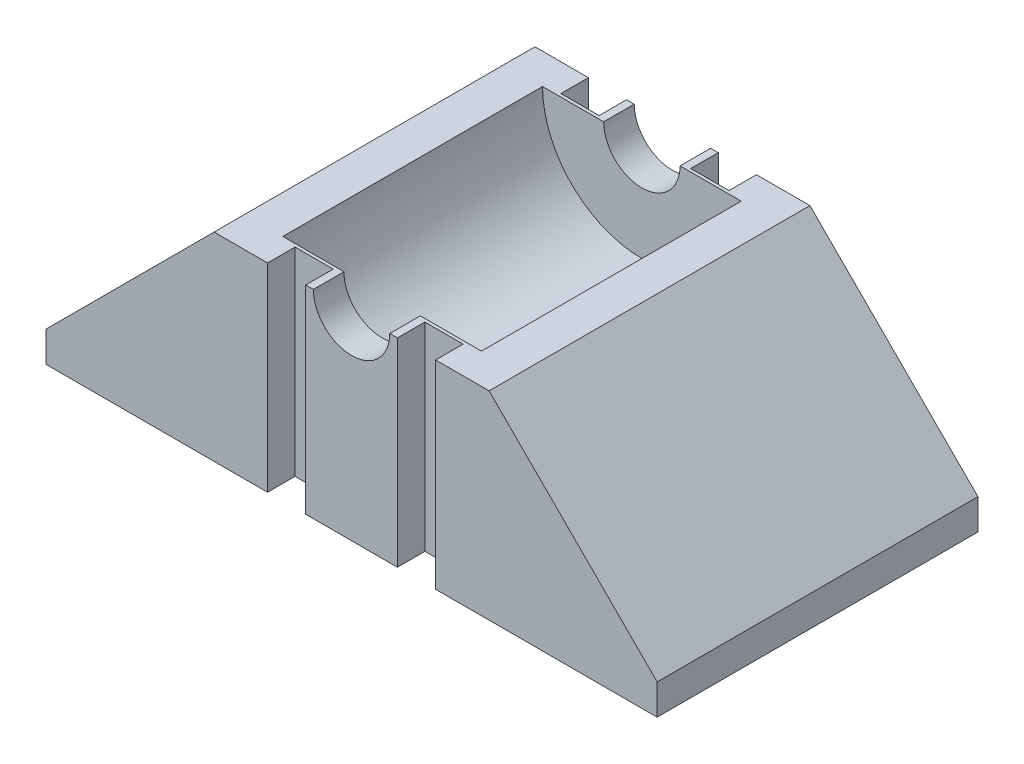
ISO-10303-21;
HEADER;
FILE_DESCRIPTION(('STEP AP214'),'2;1');
FILE_NAME('part.step','',(''),(''),'','','');
FILE_SCHEMA(('AUTOMOTIVE_DESIGN { 1 0 10303 214 1 1 1 1 }'));
ENDSEC;
DATA;
#1=APPLICATION_CONTEXT('core data for automotive mechanical design processes');
#2=APPLICATION_PROTOCOL_DEFINITION('international standard','automotive_design',2000,#1);
#3=PRODUCT_CONTEXT('',#1,'mechanical');
#4=PRODUCT('Part','Part','',(#3));
#5=PRODUCT_RELATED_PRODUCT_CATEGORY('part','',(#4));
#6=PRODUCT_DEFINITION_FORMATION('','',#4);
#7=PRODUCT_DEFINITION_CONTEXT('part definition',#1,'design');
#8=PRODUCT_DEFINITION('design','',#6,#7);
#9=PRODUCT_DEFINITION_SHAPE('','',#8);
#10=(LENGTH_UNIT() NAMED_UNIT(*) SI_UNIT(.MILLI.,.METRE.));
#11=(NAMED_UNIT(*) PLANE_ANGLE_UNIT() SI_UNIT($,.RADIAN.));
#12=(NAMED_UNIT(*) SI_UNIT($,.STERADIAN.) SOLID_ANGLE_UNIT());
#13=UNCERTAINTY_MEASURE_WITH_UNIT(LENGTH_MEASURE(1.E-05),#10,'distance_accuracy_value','');
#14=(GEOMETRIC_REPRESENTATION_CONTEXT(3) GLOBAL_UNCERTAINTY_ASSIGNED_CONTEXT((#13)) GLOBAL_UNIT_ASSIGNED_CONTEXT((#10,
#11,#12)) REPRESENTATION_CONTEXT('',''));
#15=CARTESIAN_POINT('',(0.,0.,0.));
#16=DIRECTION('',(0.,0.,1.));
#17=DIRECTION('',(1.,0.,0.));
#18=AXIS2_PLACEMENT_3D('',#15,#16,#17);
#19=CARTESIAN_POINT('',(0.,0.,10.5));
#20=DIRECTION('',(0.,0.,1.));
#21=DIRECTION('',(1.,0.,0.));
#22=AXIS2_PLACEMENT_3D('',#19,#20,#21);
#23=PLANE('',#22);
#24=DIRECTION('',(0.,-1.,0.));
#25=VECTOR('',#24,1.);
#26=CARTESIAN_POINT('',(-25.5,0.,10.5));
#27=LINE('',#26,#25);
#28=CARTESIAN_POINT('',(-25.5,13.,10.5));
#29=VERTEX_POINT('',#28);
#30=CARTESIAN_POINT('',(-25.5,0.,10.5));
#31=VERTEX_POINT('',#30);
#32=EDGE_CURVE('E11',#29,#31,#27,.T.);
#33=ORIENTED_EDGE('',*,*,#32,.F.);
#34=DIRECTION('',(-1.,0.,0.));
#35=VECTOR('',#34,1.);
#36=CARTESIAN_POINT('',(-40.,13.,10.5));
#37=LINE('',#36,#35);
#38=CARTESIAN_POINT('',(-29.,13.,10.5));
#39=VERTEX_POINT('',#38);
#40=EDGE_CURVE('E459',#29,#39,#37,.T.);
#41=ORIENTED_EDGE('',*,*,#40,.T.);
#42=DIRECTION('',(0.707106781186549,0.707106781186546,0.));
#43=VECTOR('',#42,1.);
#44=CARTESIAN_POINT('',(-20.9999999999999,21.,10.5));
#45=LINE('',#44,#43);
#46=CARTESIAN_POINT('',(-40.,2.00000000000003,10.5));
#47=VERTEX_POINT('',#46);
#48=EDGE_CURVE('E508',#39,#47,#45,.F.);
#49=ORIENTED_EDGE('',*,*,#48,.T.);
#50=DIRECTION('',(0.,-1.,0.));
#51=VECTOR('',#50,1.);
#52=CARTESIAN_POINT('',(-40.,13.,10.5));
#53=LINE('',#52,#51);
#54=CARTESIAN_POINT('',(-40.,0.,10.5));
#55=VERTEX_POINT('',#54);
#56=EDGE_CURVE('E446',#47,#55,#53,.T.);
#57=ORIENTED_EDGE('',*,*,#56,.T.);
#58=DIRECTION('',(1.,0.,0.));
#59=VECTOR('',#58,1.);
#60=CARTESIAN_POINT('',(-40.,0.,10.5));
#61=LINE('',#60,#59);
#62=EDGE_CURVE('E450',#55,#31,#61,.T.);
#63=ORIENTED_EDGE('',*,*,#62,.T.);
#64=EDGE_LOOP('',(#33,#41,#49,#57,#63));
#65=FACE_BOUND('',#64,.T.);
#66=ADVANCED_FACE('F44',(#65),#23,.T.);
#67=DIRECTION('',(0.,1.,0.));
#68=VECTOR('',#67,1.);
#69=CARTESIAN_POINT('',(-14.5,0.,10.5));
#70=LINE('',#69,#68);
#71=CARTESIAN_POINT('',(-14.5,0.,10.5));
#72=VERTEX_POINT('',#71);
#73=CARTESIAN_POINT('',(-14.5,13.,10.5));
#74=VERTEX_POINT('',#73);
#75=EDGE_CURVE('E533',#72,#74,#70,.T.);
#76=ORIENTED_EDGE('',*,*,#75,.F.);
#77=CARTESIAN_POINT('',(0.,0.,10.5));
#78=VERTEX_POINT('',#77);
#79=EDGE_CURVE('E449',#72,#78,#61,.T.);
#80=ORIENTED_EDGE('',*,*,#79,.T.);
#81=DIRECTION('',(0.,1.,0.));
#82=VECTOR('',#81,1.);
#83=CARTESIAN_POINT('',(0.,13.,10.5));
#84=LINE('',#83,#82);
#85=CARTESIAN_POINT('',(0.,1.99999999999998,10.5));
#86=VERTEX_POINT('',#85);
#87=EDGE_CURVE('E454',#78,#86,#84,.T.);
#88=ORIENTED_EDGE('',*,*,#87,.T.);
#89=DIRECTION('',(0.707106781186547,-0.707106781186548,0.));
#90=VECTOR('',#89,1.);
#91=CARTESIAN_POINT('',(0.99999999999999,0.999999999999987,10.5));
#92=LINE('',#91,#90);
#93=CARTESIAN_POINT('',(-11.,13.,10.5));
#94=VERTEX_POINT('',#93);
#95=EDGE_CURVE('E505',#86,#94,#92,.F.);
#96=ORIENTED_EDGE('',*,*,#95,.T.);
#97=EDGE_CURVE('E460',#94,#74,#37,.T.);
#98=ORIENTED_EDGE('',*,*,#97,.T.);
#99=EDGE_LOOP('',(#76,#80,#88,#96,#98));
#100=FACE_BOUND('',#99,.T.);
#101=ADVANCED_FACE('F604',(#100),#23,.T.);
#102=CARTESIAN_POINT('',(0.,0.,-10.5));
#103=DIRECTION('',(0.,0.,-1.));
#104=DIRECTION('',(1.,0.,0.));
#105=AXIS2_PLACEMENT_3D('',#102,#103,#104);
#106=PLANE('',#105);
#107=DIRECTION('',(0.,1.,0.));
#108=VECTOR('',#107,1.);
#109=CARTESIAN_POINT('',(-17.,0.,-10.5));
#110=LINE('',#109,#108);
#111=CARTESIAN_POINT('',(-17.,0.,-10.5));
#112=VERTEX_POINT('',#111);
#113=CARTESIAN_POINT('',(-17.,13.,-10.5));
#114=VERTEX_POINT('',#113);
#115=EDGE_CURVE('E527',#112,#114,#110,.T.);
#116=ORIENTED_EDGE('',*,*,#115,.F.);
#117=DIRECTION('',(1.,0.,0.));
#118=VECTOR('',#117,1.);
#119=CARTESIAN_POINT('',(-40.,0.,-10.5));
#120=LINE('',#119,#118);
#121=CARTESIAN_POINT('',(-23.,0.,-10.5));
#122=VERTEX_POINT('',#121);
#123=EDGE_CURVE('E422',#122,#112,#120,.T.);
#124=ORIENTED_EDGE('',*,*,#123,.F.);
#125=DIRECTION('',(0.,-1.,0.));
#126=VECTOR('',#125,1.);
#127=CARTESIAN_POINT('',(-23.,0.,-10.5));
#128=LINE('',#127,#126);
#129=CARTESIAN_POINT('',(-23.,13.,-10.5));
#130=VERTEX_POINT('',#129);
#131=EDGE_CURVE('E518',#130,#122,#128,.T.);
#132=ORIENTED_EDGE('',*,*,#131,.F.);
#133=DIRECTION('',(-1.,0.,0.));
#134=VECTOR('',#133,1.);
#135=CARTESIAN_POINT('',(-40.,13.,-10.5));
#136=LINE('',#135,#134);
#137=CARTESIAN_POINT('',(-22.5,13.,-10.5));
#138=VERTEX_POINT('',#137);
#139=EDGE_CURVE('E414',#138,#130,#136,.T.);
#140=ORIENTED_EDGE('',*,*,#139,.F.);
#141=CARTESIAN_POINT('',(-20.,13.,-10.5));
#142=DIRECTION('',(0.,0.,1.));
#143=DIRECTION('',(1.,0.,0.));
#144=AXIS2_PLACEMENT_3D('',#141,#142,#143);
#145=CIRCLE('',#144,2.5);
#146=CARTESIAN_POINT('',(-17.5,13.,-10.5));
#147=VERTEX_POINT('',#146);
#148=EDGE_CURVE('E386',#138,#147,#145,.T.);
#149=ORIENTED_EDGE('',*,*,#148,.T.);
#150=EDGE_CURVE('E413',#114,#147,#136,.T.);
#151=ORIENTED_EDGE('',*,*,#150,.F.);
#152=EDGE_LOOP('',(#116,#124,#132,#140,#149,#151));
#153=FACE_BOUND('',#152,.T.);
#154=ADVANCED_FACE('F577',(#153),#106,.T.);
#155=DIRECTION('',(0.,1.,0.));
#156=VECTOR('',#155,1.);
#157=CARTESIAN_POINT('',(-25.5,0.,-10.5));
#158=LINE('',#157,#156);
#159=CARTESIAN_POINT('',(-25.5,0.,-10.5));
#160=VERTEX_POINT('',#159);
#161=CARTESIAN_POINT('',(-25.5,13.,-10.5));
#162=VERTEX_POINT('',#161);
#163=EDGE_CURVE('E521',#160,#162,#158,.T.);
#164=ORIENTED_EDGE('',*,*,#163,.F.);
#165=CARTESIAN_POINT('',(-40.,0.,-10.5));
#166=VERTEX_POINT('',#165);
#167=EDGE_CURVE('E258',#166,#160,#120,.T.);
#168=ORIENTED_EDGE('',*,*,#167,.F.);
#169=DIRECTION('',(0.,-1.,0.));
#170=VECTOR('',#169,1.);
#171=CARTESIAN_POINT('',(-40.,13.,-10.5));
#172=LINE('',#171,#170);
#173=CARTESIAN_POINT('',(-40.,2.00000000000003,-10.5));
#174=VERTEX_POINT('',#173);
#175=EDGE_CURVE('E404',#174,#166,#172,.T.);
#176=ORIENTED_EDGE('',*,*,#175,.F.);
#177=DIRECTION('',(-0.707106781186549,-0.707106781186546,0.));
#178=VECTOR('',#177,1.);
#179=CARTESIAN_POINT('',(-20.9999999999999,21.,-10.5));
#180=LINE('',#179,#178);
#181=CARTESIAN_POINT('',(-29.,13.,-10.5));
#182=VERTEX_POINT('',#181);
#183=EDGE_CURVE('E497',#174,#182,#180,.F.);
#184=ORIENTED_EDGE('',*,*,#183,.T.);
#185=EDGE_CURVE('E407',#162,#182,#136,.T.);
#186=ORIENTED_EDGE('',*,*,#185,.F.);
#187=EDGE_LOOP('',(#164,#168,#176,#184,#186));
#188=FACE_BOUND('',#187,.T.);
#189=ADVANCED_FACE('F565',(#188),#106,.T.);
#190=CARTESIAN_POINT('',(-40.,13.,10.5));
#191=DIRECTION('',(0.,-1.,0.));
#192=DIRECTION('',(0.,0.,-1.));
#193=AXIS2_PLACEMENT_3D('',#190,#191,#192);
#194=PLANE('',#193);
#195=ORIENTED_EDGE('',*,*,#40,.F.);
#196=DIRECTION('',(0.,0.,-1.));
#197=VECTOR('',#196,1.);
#198=CARTESIAN_POINT('',(-25.5,13.,10.5));
#199=LINE('',#198,#197);
#200=CARTESIAN_POINT('',(-25.5,13.,8.7));
#201=VERTEX_POINT('',#200);
#202=EDGE_CURVE('E338',#29,#201,#199,.T.);
#203=ORIENTED_EDGE('',*,*,#202,.T.);
#204=DIRECTION('',(1.,0.,0.));
#205=VECTOR('',#204,1.);
#206=CARTESIAN_POINT('',(-40.,13.,8.69999999999999));
#207=LINE('',#206,#205);
#208=CARTESIAN_POINT('',(-23.,13.,8.7));
#209=VERTEX_POINT('',#208);
#210=EDGE_CURVE('E353',#201,#209,#207,.T.);
#211=ORIENTED_EDGE('',*,*,#210,.T.);
#212=DIRECTION('',(0.,0.,1.));
#213=VECTOR('',#212,1.);
#214=CARTESIAN_POINT('',(-23.,13.,10.5));
#215=LINE('',#214,#213);
#216=CARTESIAN_POINT('',(-23.,13.,10.5));
#217=VERTEX_POINT('',#216);
#218=EDGE_CURVE('E334',#209,#217,#215,.T.);
#219=ORIENTED_EDGE('',*,*,#218,.T.);
#220=CARTESIAN_POINT('',(-22.5,13.,10.5));
#221=VERTEX_POINT('',#220);
#222=EDGE_CURVE('E466',#221,#217,#37,.T.);
#223=ORIENTED_EDGE('',*,*,#222,.F.);
#224=DIRECTION('',(0.,0.,1.));
#225=VECTOR('',#224,1.);
#226=CARTESIAN_POINT('',(-22.5,13.,6.));
#227=LINE('',#226,#225);
#228=CARTESIAN_POINT('',(-22.5,13.,8.5));
#229=VERTEX_POINT('',#228);
#230=EDGE_CURVE('E426',#221,#229,#227,.F.);
#231=ORIENTED_EDGE('',*,*,#230,.T.);
#232=DIRECTION('',(1.,0.,0.));
#233=VECTOR('',#232,1.);
#234=CARTESIAN_POINT('',(-40.,13.,8.5));
#235=LINE('',#234,#233);
#236=CARTESIAN_POINT('',(-26.5,13.,8.5));
#237=VERTEX_POINT('',#236);
#238=EDGE_CURVE('E474',#237,#229,#235,.T.);
#239=ORIENTED_EDGE('',*,*,#238,.F.);
#240=DIRECTION('',(0.,0.,-1.));
#241=VECTOR('',#240,1.);
#242=CARTESIAN_POINT('',(-26.5,13.,8.5));
#243=LINE('',#242,#241);
#244=CARTESIAN_POINT('',(-26.5,13.,-8.5));
#245=VERTEX_POINT('',#244);
#246=EDGE_CURVE('E442',#237,#245,#243,.T.);
#247=ORIENTED_EDGE('',*,*,#246,.T.);
#248=DIRECTION('',(-1.,0.,0.));
#249=VECTOR('',#248,1.);
#250=CARTESIAN_POINT('',(-40.,13.,-8.5));
#251=LINE('',#250,#249);
#252=CARTESIAN_POINT('',(-22.5,13.,-8.5));
#253=VERTEX_POINT('',#252);
#254=EDGE_CURVE('E481',#253,#245,#251,.T.);
#255=ORIENTED_EDGE('',*,*,#254,.F.);
#256=DIRECTION('',(0.,0.,-1.));
#257=VECTOR('',#256,1.);
#258=CARTESIAN_POINT('',(-22.5,13.,-6.));
#259=LINE('',#258,#257);
#260=EDGE_CURVE('E397',#138,#253,#259,.F.);
#261=ORIENTED_EDGE('',*,*,#260,.F.);
#262=ORIENTED_EDGE('',*,*,#139,.T.);
#263=DIRECTION('',(0.,0.,1.));
#264=VECTOR('',#263,1.);
#265=CARTESIAN_POINT('',(-23.,13.,10.5));
#266=LINE('',#265,#264);
#267=CARTESIAN_POINT('',(-23.,13.,-8.7));
#268=VERTEX_POINT('',#267);
#269=EDGE_CURVE('E312',#130,#268,#266,.T.);
#270=ORIENTED_EDGE('',*,*,#269,.T.);
#271=DIRECTION('',(-1.,0.,0.));
#272=VECTOR('',#271,1.);
#273=CARTESIAN_POINT('',(-40.,13.,-8.69999999999999));
#274=LINE('',#273,#272);
#275=CARTESIAN_POINT('',(-25.5,13.,-8.7));
#276=VERTEX_POINT('',#275);
#277=EDGE_CURVE('E346',#268,#276,#274,.T.);
#278=ORIENTED_EDGE('',*,*,#277,.T.);
#279=DIRECTION('',(0.,0.,-1.));
#280=VECTOR('',#279,1.);
#281=CARTESIAN_POINT('',(-25.5,13.,10.5));
#282=LINE('',#281,#280);
#283=EDGE_CURVE('E237',#276,#162,#282,.T.);
#284=ORIENTED_EDGE('',*,*,#283,.T.);
#285=ORIENTED_EDGE('',*,*,#185,.T.);
#286=DIRECTION('',(0.,0.,1.));
#287=VECTOR('',#286,1.);
#288=CARTESIAN_POINT('',(-29.,13.,10.5));
#289=LINE('',#288,#287);
#290=EDGE_CURVE('E501',#182,#39,#289,.T.);
#291=ORIENTED_EDGE('',*,*,#290,.T.);
#292=EDGE_LOOP('',(#195,#203,#211,#219,#223,#231,#239,#247,#255,#261,#262,#270,#278,#284,#285,#291));
#293=FACE_BOUND('',#292,.T.);
#294=ADVANCED_FACE('F545',(#293),#194,.F.);
#295=DIRECTION('',(-1.,0.,0.));
#296=VECTOR('',#295,1.);
#297=CARTESIAN_POINT('',(-40.,13.,-8.7));
#298=LINE('',#297,#296);
#299=CARTESIAN_POINT('',(-14.5,13.,-8.7));
#300=VERTEX_POINT('',#299);
#301=CARTESIAN_POINT('',(-17.,13.,-8.7));
#302=VERTEX_POINT('',#301);
#303=EDGE_CURVE('E349',#300,#302,#298,.T.);
#304=ORIENTED_EDGE('',*,*,#303,.T.);
#305=DIRECTION('',(0.,0.,-1.));
#306=VECTOR('',#305,1.);
#307=CARTESIAN_POINT('',(-17.,13.,10.5));
#308=LINE('',#307,#306);
#309=EDGE_CURVE('E324',#302,#114,#308,.T.);
#310=ORIENTED_EDGE('',*,*,#309,.T.);
#311=ORIENTED_EDGE('',*,*,#150,.T.);
#312=DIRECTION('',(0.,0.,-1.));
#313=VECTOR('',#312,1.);
#314=CARTESIAN_POINT('',(-17.5,13.,-6.));
#315=LINE('',#314,#313);
#316=CARTESIAN_POINT('',(-17.5,13.,-8.5));
#317=VERTEX_POINT('',#316);
#318=EDGE_CURVE('E393',#317,#147,#315,.T.);
#319=ORIENTED_EDGE('',*,*,#318,.F.);
#320=CARTESIAN_POINT('',(-13.5,13.,-8.5));
#321=VERTEX_POINT('',#320);
#322=EDGE_CURVE('E482',#321,#317,#251,.T.);
#323=ORIENTED_EDGE('',*,*,#322,.F.);
#324=DIRECTION('',(0.,0.,-1.));
#325=VECTOR('',#324,1.);
#326=CARTESIAN_POINT('',(-13.5,13.,8.5));
#327=LINE('',#326,#325);
#328=CARTESIAN_POINT('',(-13.5,13.,8.5));
#329=VERTEX_POINT('',#328);
#330=EDGE_CURVE('E438',#321,#329,#327,.F.);
#331=ORIENTED_EDGE('',*,*,#330,.T.);
#332=CARTESIAN_POINT('',(-17.5,13.,8.5));
#333=VERTEX_POINT('',#332);
#334=EDGE_CURVE('E473',#333,#329,#235,.T.);
#335=ORIENTED_EDGE('',*,*,#334,.F.);
#336=DIRECTION('',(0.,0.,1.));
#337=VECTOR('',#336,1.);
#338=CARTESIAN_POINT('',(-17.5,13.,6.));
#339=LINE('',#338,#337);
#340=CARTESIAN_POINT('',(-17.5,13.,10.5));
#341=VERTEX_POINT('',#340);
#342=EDGE_CURVE('E430',#333,#341,#339,.T.);
#343=ORIENTED_EDGE('',*,*,#342,.T.);
#344=CARTESIAN_POINT('',(-17.,13.,10.5));
#345=VERTEX_POINT('',#344);
#346=EDGE_CURVE('E465',#345,#341,#37,.T.);
#347=ORIENTED_EDGE('',*,*,#346,.F.);
#348=DIRECTION('',(0.,0.,-1.));
#349=VECTOR('',#348,1.);
#350=CARTESIAN_POINT('',(-17.,13.,10.5));
#351=LINE('',#350,#349);
#352=CARTESIAN_POINT('',(-17.,13.,8.7));
#353=VERTEX_POINT('',#352);
#354=EDGE_CURVE('E61',#345,#353,#351,.T.);
#355=ORIENTED_EDGE('',*,*,#354,.T.);
#356=DIRECTION('',(1.,0.,0.));
#357=VECTOR('',#356,1.);
#358=CARTESIAN_POINT('',(-40.,13.,8.7));
#359=LINE('',#358,#357);
#360=CARTESIAN_POINT('',(-14.5,13.,8.7));
#361=VERTEX_POINT('',#360);
#362=EDGE_CURVE('E342',#353,#361,#359,.T.);
#363=ORIENTED_EDGE('',*,*,#362,.T.);
#364=DIRECTION('',(0.,0.,1.));
#365=VECTOR('',#364,1.);
#366=CARTESIAN_POINT('',(-14.5,13.,10.5));
#367=LINE('',#366,#365);
#368=EDGE_CURVE('E330',#361,#74,#367,.T.);
#369=ORIENTED_EDGE('',*,*,#368,.T.);
#370=ORIENTED_EDGE('',*,*,#97,.F.);
#371=DIRECTION('',(0.,0.,-1.));
#372=VECTOR('',#371,1.);
#373=CARTESIAN_POINT('',(-11.,13.,10.5));
#374=LINE('',#373,#372);
#375=CARTESIAN_POINT('',(-11.,13.,-10.5));
#376=VERTEX_POINT('',#375);
#377=EDGE_CURVE('E511',#94,#376,#374,.T.);
#378=ORIENTED_EDGE('',*,*,#377,.T.);
#379=CARTESIAN_POINT('',(-14.5,13.,-10.5));
#380=VERTEX_POINT('',#379);
#381=EDGE_CURVE('E408',#376,#380,#136,.T.);
#382=ORIENTED_EDGE('',*,*,#381,.T.);
#383=DIRECTION('',(0.,0.,1.));
#384=VECTOR('',#383,1.);
#385=CARTESIAN_POINT('',(-14.5,13.,10.5));
#386=LINE('',#385,#384);
#387=EDGE_CURVE('E320',#380,#300,#386,.T.);
#388=ORIENTED_EDGE('',*,*,#387,.T.);
#389=EDGE_LOOP('',(#304,#310,#311,#319,#323,#331,#335,#343,#347,#355,#363,#369,#370,#378,#382,#388));
#390=FACE_BOUND('',#389,.T.);
#391=ADVANCED_FACE('F601',(#390),#194,.F.);
#392=CARTESIAN_POINT('',(-40.,13.,10.5));
#393=DIRECTION('',(1.,0.,0.));
#394=DIRECTION('',(0.,0.,-1.));
#395=AXIS2_PLACEMENT_3D('',#392,#393,#394);
#396=PLANE('',#395);
#397=ORIENTED_EDGE('',*,*,#56,.F.);
#398=DIRECTION('',(0.,0.,-1.));
#399=VECTOR('',#398,1.);
#400=CARTESIAN_POINT('',(-40.,2.00000000000002,10.5));
#401=LINE('',#400,#399);
#402=EDGE_CURVE('E490',#47,#174,#401,.T.);
#403=ORIENTED_EDGE('',*,*,#402,.T.);
#404=ORIENTED_EDGE('',*,*,#175,.T.);
#405=DIRECTION('',(0.,0.,-1.));
#406=VECTOR('',#405,1.);
#407=CARTESIAN_POINT('',(-40.,0.,10.5));
#408=LINE('',#407,#406);
#409=EDGE_CURVE('E470',#55,#166,#408,.T.);
#410=ORIENTED_EDGE('',*,*,#409,.F.);
#411=EDGE_LOOP('',(#397,#403,#404,#410));
#412=FACE_BOUND('',#411,.T.);
#413=ADVANCED_FACE('F562',(#412),#396,.F.);
#414=CARTESIAN_POINT('',(-40.,0.,10.5));
#415=DIRECTION('',(0.,1.,0.));
#416=DIRECTION('',(0.,0.,1.));
#417=AXIS2_PLACEMENT_3D('',#414,#415,#416);
#418=PLANE('',#417);
#419=CARTESIAN_POINT('',(-31.,0.,-5.5));
#420=DIRECTION('',(0.,-1.,0.));
#421=DIRECTION('',(0.,0.,1.));
#422=AXIS2_PLACEMENT_3D('',#419,#420,#421);
#423=CIRCLE('',#422,4.);
#424=CARTESIAN_POINT('',(-31.,0.,-1.5));
#425=VERTEX_POINT('',#424);
#426=EDGE_CURVE('E375',#425,#425,#423,.T.);
#427=ORIENTED_EDGE('',*,*,#426,.F.);
#428=EDGE_LOOP('',(#427));
#429=FACE_BOUND('',#428,.T.);
#430=CARTESIAN_POINT('',(-9.,0.,-5.5));
#431=DIRECTION('',(0.,-1.,0.));
#432=DIRECTION('',(0.,0.,-1.));
#433=AXIS2_PLACEMENT_3D('',#430,#431,#432);
#434=CIRCLE('',#433,4.);
#435=CARTESIAN_POINT('',(-9.,0.,-9.5));
#436=VERTEX_POINT('',#435);
#437=EDGE_CURVE('E367',#436,#436,#434,.T.);
#438=ORIENTED_EDGE('',*,*,#437,.F.);
#439=EDGE_LOOP('',(#438));
#440=FACE_BOUND('',#439,.T.);
#441=CARTESIAN_POINT('',(-9.,0.,5.5));
#442=DIRECTION('',(0.,-1.,0.));
#443=DIRECTION('',(0.,0.,1.));
#444=AXIS2_PLACEMENT_3D('',#441,#442,#443);
#445=CIRCLE('',#444,4.);
#446=CARTESIAN_POINT('',(-9.,0.,9.5));
#447=VERTEX_POINT('',#446);
#448=EDGE_CURVE('E358',#447,#447,#445,.T.);
#449=ORIENTED_EDGE('',*,*,#448,.F.);
#450=EDGE_LOOP('',(#449));
#451=FACE_BOUND('',#450,.T.);
#452=CARTESIAN_POINT('',(-31.,0.,5.5));
#453=DIRECTION('',(0.,-1.,0.));
#454=DIRECTION('',(0.,0.,-1.));
#455=AXIS2_PLACEMENT_3D('',#452,#453,#454);
#456=CIRCLE('',#455,4.);
#457=CARTESIAN_POINT('',(-31.,0.,1.5));
#458=VERTEX_POINT('',#457);
#459=EDGE_CURVE('E362',#458,#458,#456,.T.);
#460=ORIENTED_EDGE('',*,*,#459,.F.);
#461=EDGE_LOOP('',(#460));
#462=FACE_BOUND('',#461,.T.);
#463=DIRECTION('',(1.,0.,0.));
#464=VECTOR('',#463,1.);
#465=CARTESIAN_POINT('',(-25.5,0.,8.7));
#466=LINE('',#465,#464);
#467=CARTESIAN_POINT('',(-25.5,0.,8.7));
#468=VERTEX_POINT('',#467);
#469=CARTESIAN_POINT('',(-23.,0.,8.7));
#470=VERTEX_POINT('',#469);
#471=EDGE_CURVE('E277',#468,#470,#466,.T.);
#472=ORIENTED_EDGE('',*,*,#471,.F.);
#473=DIRECTION('',(0.,0.,-1.));
#474=VECTOR('',#473,1.);
#475=CARTESIAN_POINT('',(-25.5,0.,10.5));
#476=LINE('',#475,#474);
#477=EDGE_CURVE('E281',#31,#468,#476,.T.);
#478=ORIENTED_EDGE('',*,*,#477,.F.);
#479=ORIENTED_EDGE('',*,*,#62,.F.);
#480=ORIENTED_EDGE('',*,*,#409,.T.);
#481=ORIENTED_EDGE('',*,*,#167,.T.);
#482=DIRECTION('',(0.,0.,-1.));
#483=VECTOR('',#482,1.);
#484=CARTESIAN_POINT('',(-25.5,0.,-10.5));
#485=LINE('',#484,#483);
#486=CARTESIAN_POINT('',(-25.5,0.,-8.7));
#487=VERTEX_POINT('',#486);
#488=EDGE_CURVE('E234',#487,#160,#485,.T.);
#489=ORIENTED_EDGE('',*,*,#488,.F.);
#490=DIRECTION('',(-1.,0.,0.));
#491=VECTOR('',#490,1.);
#492=CARTESIAN_POINT('',(-25.5,0.,-8.7));
#493=LINE('',#492,#491);
#494=CARTESIAN_POINT('',(-23.,0.,-8.7));
#495=VERTEX_POINT('',#494);
#496=EDGE_CURVE('E244',#495,#487,#493,.T.);
#497=ORIENTED_EDGE('',*,*,#496,.F.);
#498=DIRECTION('',(0.,0.,1.));
#499=VECTOR('',#498,1.);
#500=CARTESIAN_POINT('',(-23.,0.,-10.5));
#501=LINE('',#500,#499);
#502=EDGE_CURVE('E251',#122,#495,#501,.T.);
#503=ORIENTED_EDGE('',*,*,#502,.F.);
#504=ORIENTED_EDGE('',*,*,#123,.T.);
#505=DIRECTION('',(0.,0.,-1.));
#506=VECTOR('',#505,1.);
#507=CARTESIAN_POINT('',(-17.,0.,-10.5));
#508=LINE('',#507,#506);
#509=CARTESIAN_POINT('',(-17.,0.,-8.7));
#510=VERTEX_POINT('',#509);
#511=EDGE_CURVE('E287',#510,#112,#508,.T.);
#512=ORIENTED_EDGE('',*,*,#511,.F.);
#513=DIRECTION('',(-1.,0.,0.));
#514=VECTOR('',#513,1.);
#515=CARTESIAN_POINT('',(-14.5,0.,-8.7));
#516=LINE('',#515,#514);
#517=CARTESIAN_POINT('',(-14.5,0.,-8.7));
#518=VERTEX_POINT('',#517);
#519=EDGE_CURVE('E291',#518,#510,#516,.T.);
#520=ORIENTED_EDGE('',*,*,#519,.F.);
#521=DIRECTION('',(0.,0.,1.));
#522=VECTOR('',#521,1.);
#523=CARTESIAN_POINT('',(-14.5,0.,-10.5));
#524=LINE('',#523,#522);
#525=CARTESIAN_POINT('',(-14.5,0.,-10.5));
#526=VERTEX_POINT('',#525);
#527=EDGE_CURVE('E274',#526,#518,#524,.T.);
#528=ORIENTED_EDGE('',*,*,#527,.F.);
#529=CARTESIAN_POINT('',(0.,0.,-10.5));
#530=VERTEX_POINT('',#529);
#531=EDGE_CURVE('E418',#526,#530,#120,.T.);
#532=ORIENTED_EDGE('',*,*,#531,.T.);
#533=DIRECTION('',(0.,0.,-1.));
#534=VECTOR('',#533,1.);
#535=CARTESIAN_POINT('',(0.,0.,10.5));
#536=LINE('',#535,#534);
#537=EDGE_CURVE('E464',#78,#530,#536,.T.);
#538=ORIENTED_EDGE('',*,*,#537,.F.);
#539=ORIENTED_EDGE('',*,*,#79,.F.);
#540=DIRECTION('',(0.,0.,1.));
#541=VECTOR('',#540,1.);
#542=CARTESIAN_POINT('',(-14.5,0.,10.5));
#543=LINE('',#542,#541);
#544=CARTESIAN_POINT('',(-14.5,0.,8.7));
#545=VERTEX_POINT('',#544);
#546=EDGE_CURVE('E285',#545,#72,#543,.T.);
#547=ORIENTED_EDGE('',*,*,#546,.F.);
#548=DIRECTION('',(1.,0.,0.));
#549=VECTOR('',#548,1.);
#550=CARTESIAN_POINT('',(-14.5,0.,8.7));
#551=LINE('',#550,#549);
#552=CARTESIAN_POINT('',(-17.,0.,8.7));
#553=VERTEX_POINT('',#552);
#554=EDGE_CURVE('E304',#553,#545,#551,.T.);
#555=ORIENTED_EDGE('',*,*,#554,.F.);
#556=DIRECTION('',(0.,0.,-1.));
#557=VECTOR('',#556,1.);
#558=CARTESIAN_POINT('',(-17.,0.,10.5));
#559=LINE('',#558,#557);
#560=CARTESIAN_POINT('',(-17.,0.,10.5));
#561=VERTEX_POINT('',#560);
#562=EDGE_CURVE('E300',#561,#553,#559,.T.);
#563=ORIENTED_EDGE('',*,*,#562,.F.);
#564=CARTESIAN_POINT('',(-23.,0.,10.5));
#565=VERTEX_POINT('',#564);
#566=EDGE_CURVE('E455',#565,#561,#61,.T.);
#567=ORIENTED_EDGE('',*,*,#566,.F.);
#568=DIRECTION('',(0.,0.,1.));
#569=VECTOR('',#568,1.);
#570=CARTESIAN_POINT('',(-23.,0.,10.5));
#571=LINE('',#570,#569);
#572=EDGE_CURVE('E69',#470,#565,#571,.T.);
#573=ORIENTED_EDGE('',*,*,#572,.F.);
#574=EDGE_LOOP('',(#472,#478,#479,#480,#481,#489,#497,#503,#504,#512,#520,#528,#532,#538,#539,
#547,#555,#563,#567,#573));
#575=FACE_BOUND('',#574,.T.);
#576=ADVANCED_FACE('F255',(#429,#440,#451,#462,#575),#418,.F.);
#577=CARTESIAN_POINT('',(0.,13.,10.5));
#578=DIRECTION('',(-1.,0.,0.));
#579=DIRECTION('',(0.,0.,1.));
#580=AXIS2_PLACEMENT_3D('',#577,#578,#579);
#581=PLANE('',#580);
#582=DIRECTION('',(0.,1.,0.));
#583=VECTOR('',#582,1.);
#584=CARTESIAN_POINT('',(0.,13.,-10.5));
#585=LINE('',#584,#583);
#586=CARTESIAN_POINT('',(0.,1.99999999999998,-10.5));
#587=VERTEX_POINT('',#586);
#588=EDGE_CURVE('E412',#530,#587,#585,.T.);
#589=ORIENTED_EDGE('',*,*,#588,.T.);
#590=DIRECTION('',(0.,0.,1.));
#591=VECTOR('',#590,1.);
#592=CARTESIAN_POINT('',(0.,1.99999999999998,10.5));
#593=LINE('',#592,#591);
#594=EDGE_CURVE('E515',#587,#86,#593,.T.);
#595=ORIENTED_EDGE('',*,*,#594,.T.);
#596=ORIENTED_EDGE('',*,*,#87,.F.);
#597=ORIENTED_EDGE('',*,*,#537,.T.);
#598=EDGE_LOOP('',(#589,#595,#596,#597));
#599=FACE_BOUND('',#598,.T.);
#600=ADVANCED_FACE('F592',(#599),#581,.F.);
#601=DIRECTION('',(0.,1.,0.));
#602=VECTOR('',#601,1.);
#603=CARTESIAN_POINT('',(-23.,0.,10.5));
#604=LINE('',#603,#602);
#605=EDGE_CURVE('E54',#565,#217,#604,.T.);
#606=ORIENTED_EDGE('',*,*,#605,.F.);
#607=ORIENTED_EDGE('',*,*,#566,.T.);
#608=DIRECTION('',(0.,-1.,0.));
#609=VECTOR('',#608,1.);
#610=CARTESIAN_POINT('',(-17.,0.,10.5));
#611=LINE('',#610,#609);
#612=EDGE_CURVE('E530',#345,#561,#611,.T.);
#613=ORIENTED_EDGE('',*,*,#612,.F.);
#614=ORIENTED_EDGE('',*,*,#346,.T.);
#615=CARTESIAN_POINT('',(-20.,13.,10.5));
#616=DIRECTION('',(0.,0.,1.));
#617=DIRECTION('',(1.,0.,0.));
#618=AXIS2_PLACEMENT_3D('',#615,#616,#617);
#619=CIRCLE('',#618,2.5);
#620=EDGE_CURVE('E421',#221,#341,#619,.T.);
#621=ORIENTED_EDGE('',*,*,#620,.F.);
#622=ORIENTED_EDGE('',*,*,#222,.T.);
#623=EDGE_LOOP('',(#606,#607,#613,#614,#621,#622));
#624=FACE_BOUND('',#623,.T.);
#625=ADVANCED_FACE('F547',(#624),#23,.T.);
#626=CARTESIAN_POINT('',(-20.,13.,8.5));
#627=DIRECTION('',(0.,0.,-1.));
#628=DIRECTION('',(-1.,0.,0.));
#629=AXIS2_PLACEMENT_3D('',#626,#627,#628);
#630=PLANE('',#629);
#631=CARTESIAN_POINT('',(-20.,13.,8.5));
#632=DIRECTION('',(0.,0.,-1.));
#633=DIRECTION('',(-1.,0.,0.));
#634=AXIS2_PLACEMENT_3D('',#631,#632,#633);
#635=CIRCLE('',#634,2.5);
#636=EDGE_CURVE('E478',#333,#229,#635,.T.);
#637=ORIENTED_EDGE('',*,*,#636,.F.);
#638=ORIENTED_EDGE('',*,*,#334,.T.);
#639=CARTESIAN_POINT('',(-20.,13.,8.5));
#640=DIRECTION('',(0.,0.,-1.));
#641=DIRECTION('',(-1.,0.,0.));
#642=AXIS2_PLACEMENT_3D('',#639,#640,#641);
#643=CIRCLE('',#642,6.5);
#644=EDGE_CURVE('E434',#329,#237,#643,.T.);
#645=ORIENTED_EDGE('',*,*,#644,.T.);
#646=ORIENTED_EDGE('',*,*,#238,.T.);
#647=EDGE_LOOP('',(#637,#638,#645,#646));
#648=FACE_BOUND('',#647,.T.);
#649=ADVANCED_FACE('F619',(#648),#630,.T.);
#650=CARTESIAN_POINT('',(-20.,13.,8.5));
#651=DIRECTION('',(0.,0.,-1.));
#652=DIRECTION('',(-1.,0.,0.));
#653=AXIS2_PLACEMENT_3D('',#650,#651,#652);
#654=CYLINDRICAL_SURFACE('',#653,6.5);
#655=ORIENTED_EDGE('',*,*,#644,.F.);
#656=ORIENTED_EDGE('',*,*,#330,.F.);
#657=CARTESIAN_POINT('',(-20.,13.,-8.5));
#658=DIRECTION('',(0.,0.,-1.));
#659=DIRECTION('',(-1.,0.,0.));
#660=AXIS2_PLACEMENT_3D('',#657,#658,#659);
#661=CIRCLE('',#660,6.5);
#662=EDGE_CURVE('E400',#321,#245,#661,.T.);
#663=ORIENTED_EDGE('',*,*,#662,.T.);
#664=ORIENTED_EDGE('',*,*,#246,.F.);
#665=EDGE_LOOP('',(#655,#656,#663,#664));
#666=FACE_BOUND('',#665,.T.);
#667=ADVANCED_FACE('F622',(#666),#654,.F.);
#668=CARTESIAN_POINT('',(-20.,13.,6.));
#669=DIRECTION('',(0.,0.,1.));
#670=DIRECTION('',(1.,0.,0.));
#671=AXIS2_PLACEMENT_3D('',#668,#669,#670);
#672=CYLINDRICAL_SURFACE('',#671,2.5);
#673=ORIENTED_EDGE('',*,*,#636,.T.);
#674=ORIENTED_EDGE('',*,*,#230,.F.);
#675=ORIENTED_EDGE('',*,*,#620,.T.);
#676=ORIENTED_EDGE('',*,*,#342,.F.);
#677=EDGE_LOOP('',(#673,#674,#675,#676));
#678=FACE_BOUND('',#677,.T.);
#679=ADVANCED_FACE('F615',(#678),#672,.F.);
#680=DIRECTION('',(0.,-1.,0.));
#681=VECTOR('',#680,1.);
#682=CARTESIAN_POINT('',(-14.5,0.,-10.5));
#683=LINE('',#682,#681);
#684=EDGE_CURVE('E524',#380,#526,#683,.T.);
#685=ORIENTED_EDGE('',*,*,#684,.F.);
#686=ORIENTED_EDGE('',*,*,#381,.F.);
#687=DIRECTION('',(-0.707106781186547,0.707106781186548,0.));
#688=VECTOR('',#687,1.);
#689=CARTESIAN_POINT('',(0.99999999999999,0.999999999999987,-10.5));
#690=LINE('',#689,#688);
#691=EDGE_CURVE('E494',#376,#587,#690,.F.);
#692=ORIENTED_EDGE('',*,*,#691,.T.);
#693=ORIENTED_EDGE('',*,*,#588,.F.);
#694=ORIENTED_EDGE('',*,*,#531,.F.);
#695=EDGE_LOOP('',(#685,#686,#692,#693,#694));
#696=FACE_BOUND('',#695,.T.);
#697=ADVANCED_FACE('F594',(#696),#106,.T.);
#698=CARTESIAN_POINT('',(-20.,13.,-8.5));
#699=DIRECTION('',(0.,0.,1.));
#700=DIRECTION('',(-1.,0.,0.));
#701=AXIS2_PLACEMENT_3D('',#698,#699,#700);
#702=PLANE('',#701);
#703=ORIENTED_EDGE('',*,*,#322,.T.);
#704=CARTESIAN_POINT('',(-20.,13.,-8.5));
#705=DIRECTION('',(0.,0.,1.));
#706=DIRECTION('',(1.,0.,0.));
#707=AXIS2_PLACEMENT_3D('',#704,#705,#706);
#708=CIRCLE('',#707,2.5);
#709=EDGE_CURVE('E486',#317,#253,#708,.F.);
#710=ORIENTED_EDGE('',*,*,#709,.T.);
#711=ORIENTED_EDGE('',*,*,#254,.T.);
#712=ORIENTED_EDGE('',*,*,#662,.F.);
#713=EDGE_LOOP('',(#703,#710,#711,#712));
#714=FACE_BOUND('',#713,.T.);
#715=ADVANCED_FACE('F627',(#714),#702,.T.);
#716=CARTESIAN_POINT('',(-20.,13.,-6.));
#717=DIRECTION('',(0.,0.,-1.));
#718=DIRECTION('',(-1.,0.,0.));
#719=AXIS2_PLACEMENT_3D('',#716,#717,#718);
#720=CYLINDRICAL_SURFACE('',#719,2.5);
#721=ORIENTED_EDGE('',*,*,#260,.T.);
#722=ORIENTED_EDGE('',*,*,#709,.F.);
#723=ORIENTED_EDGE('',*,*,#318,.T.);
#724=ORIENTED_EDGE('',*,*,#148,.F.);
#725=EDGE_LOOP('',(#721,#722,#723,#724));
#726=FACE_BOUND('',#725,.T.);
#727=ADVANCED_FACE('F636',(#726),#720,.F.);
#728=CARTESIAN_POINT('',(-31.,5.,5.5));
#729=DIRECTION('',(0.,-1.,0.));
#730=DIRECTION('',(0.,0.,-1.));
#731=AXIS2_PLACEMENT_3D('',#728,#729,#730);
#732=CYLINDRICAL_SURFACE('',#731,4.);
#733=CARTESIAN_POINT('',(-31.,5.,5.5));
#734=DIRECTION('',(0.,-1.,0.));
#735=DIRECTION('',(0.,0.,-1.));
#736=AXIS2_PLACEMENT_3D('',#733,#734,#735);
#737=CIRCLE('',#736,4.);
#738=CARTESIAN_POINT('',(-31.,5.,1.5));
#739=VERTEX_POINT('',#738);
#740=EDGE_CURVE('E382',#739,#739,#737,.T.);
#741=ORIENTED_EDGE('',*,*,#740,.F.);
#742=EDGE_LOOP('',(#741));
#743=FACE_BOUND('',#742,.T.);
#744=ORIENTED_EDGE('',*,*,#459,.T.);
#745=EDGE_LOOP('',(#744));
#746=FACE_BOUND('',#745,.T.);
#747=ADVANCED_FACE('F638',(#743,#746),#732,.F.);
#748=CARTESIAN_POINT('',(-31.,5.,5.5));
#749=DIRECTION('',(0.,-1.,0.));
#750=DIRECTION('',(0.,0.,-1.));
#751=AXIS2_PLACEMENT_3D('',#748,#749,#750);
#752=PLANE('',#751);
#753=ORIENTED_EDGE('',*,*,#740,.T.);
#754=EDGE_LOOP('',(#753));
#755=FACE_BOUND('',#754,.T.);
#756=ADVANCED_FACE('F644',(#755),#752,.T.);
#757=CARTESIAN_POINT('',(-9.,5.,5.5));
#758=DIRECTION('',(0.,-1.,0.));
#759=DIRECTION('',(0.,0.,-1.));
#760=AXIS2_PLACEMENT_3D('',#757,#758,#759);
#761=CYLINDRICAL_SURFACE('',#760,4.);
#762=CARTESIAN_POINT('',(-9.,5.,5.5));
#763=DIRECTION('',(0.,-1.,0.));
#764=DIRECTION('',(0.,0.,1.));
#765=AXIS2_PLACEMENT_3D('',#762,#763,#764);
#766=CIRCLE('',#765,4.);
#767=CARTESIAN_POINT('',(-9.,5.,9.5));
#768=VERTEX_POINT('',#767);
#769=EDGE_CURVE('E363',#768,#768,#766,.T.);
#770=ORIENTED_EDGE('',*,*,#769,.F.);
#771=EDGE_LOOP('',(#770));
#772=FACE_BOUND('',#771,.T.);
#773=ORIENTED_EDGE('',*,*,#448,.T.);
#774=EDGE_LOOP('',(#773));
#775=FACE_BOUND('',#774,.T.);
#776=ADVANCED_FACE('F693',(#772,#775),#761,.F.);
#777=CARTESIAN_POINT('',(-9.,5.,5.5));
#778=DIRECTION('',(0.,1.,0.));
#779=DIRECTION('',(0.,0.,1.));
#780=AXIS2_PLACEMENT_3D('',#777,#778,#779);
#781=PLANE('',#780);
#782=ORIENTED_EDGE('',*,*,#769,.T.);
#783=EDGE_LOOP('',(#782));
#784=FACE_BOUND('',#783,.T.);
#785=ADVANCED_FACE('F698',(#784),#781,.F.);
#786=CARTESIAN_POINT('',(-9.,5.,-5.5));
#787=DIRECTION('',(0.,-1.,0.));
#788=DIRECTION('',(0.,0.,-1.));
#789=AXIS2_PLACEMENT_3D('',#786,#787,#788);
#790=CYLINDRICAL_SURFACE('',#789,4.);
#791=CARTESIAN_POINT('',(-9.,5.,-5.5));
#792=DIRECTION('',(0.,-1.,0.));
#793=DIRECTION('',(0.,0.,-1.));
#794=AXIS2_PLACEMENT_3D('',#791,#792,#793);
#795=CIRCLE('',#794,4.);
#796=CARTESIAN_POINT('',(-9.,5.,-9.5));
#797=VERTEX_POINT('',#796);
#798=EDGE_CURVE('E371',#797,#797,#795,.T.);
#799=ORIENTED_EDGE('',*,*,#798,.F.);
#800=EDGE_LOOP('',(#799));
#801=FACE_BOUND('',#800,.T.);
#802=ORIENTED_EDGE('',*,*,#437,.T.);
#803=EDGE_LOOP('',(#802));
#804=FACE_BOUND('',#803,.T.);
#805=ADVANCED_FACE('F708',(#801,#804),#790,.F.);
#806=CARTESIAN_POINT('',(-9.,5.,-5.5));
#807=DIRECTION('',(0.,-1.,0.));
#808=DIRECTION('',(0.,0.,-1.));
#809=AXIS2_PLACEMENT_3D('',#806,#807,#808);
#810=PLANE('',#809);
#811=ORIENTED_EDGE('',*,*,#798,.T.);
#812=EDGE_LOOP('',(#811));
#813=FACE_BOUND('',#812,.T.);
#814=ADVANCED_FACE('F687',(#813),#810,.T.);
#815=CARTESIAN_POINT('',(-31.,5.,-5.5));
#816=DIRECTION('',(0.,-1.,0.));
#817=DIRECTION('',(0.,0.,-1.));
#818=AXIS2_PLACEMENT_3D('',#815,#816,#817);
#819=CYLINDRICAL_SURFACE('',#818,4.);
#820=CARTESIAN_POINT('',(-31.,5.,-5.5));
#821=DIRECTION('',(0.,-1.,0.));
#822=DIRECTION('',(0.,0.,1.));
#823=AXIS2_PLACEMENT_3D('',#820,#821,#822);
#824=CIRCLE('',#823,4.);
#825=CARTESIAN_POINT('',(-31.,5.,-1.5));
#826=VERTEX_POINT('',#825);
#827=EDGE_CURVE('E357',#826,#826,#824,.T.);
#828=ORIENTED_EDGE('',*,*,#827,.F.);
#829=EDGE_LOOP('',(#828));
#830=FACE_BOUND('',#829,.T.);
#831=ORIENTED_EDGE('',*,*,#426,.T.);
#832=EDGE_LOOP('',(#831));
#833=FACE_BOUND('',#832,.T.);
#834=ADVANCED_FACE('F681',(#830,#833),#819,.F.);
#835=CARTESIAN_POINT('',(-31.,5.,-5.5));
#836=DIRECTION('',(0.,1.,0.));
#837=DIRECTION('',(0.,0.,1.));
#838=AXIS2_PLACEMENT_3D('',#835,#836,#837);
#839=PLANE('',#838);
#840=ORIENTED_EDGE('',*,*,#827,.T.);
#841=EDGE_LOOP('',(#840));
#842=FACE_BOUND('',#841,.T.);
#843=ADVANCED_FACE('F676',(#842),#839,.F.);
#844=CARTESIAN_POINT('',(-40.,2.00000000000002,10.5));
#845=DIRECTION('',(0.707106781186546,-0.707106781186549,0.));
#846=DIRECTION('',(0.,0.,-1.));
#847=AXIS2_PLACEMENT_3D('',#844,#845,#846);
#848=PLANE('',#847);
#849=ORIENTED_EDGE('',*,*,#48,.F.);
#850=ORIENTED_EDGE('',*,*,#290,.F.);
#851=ORIENTED_EDGE('',*,*,#183,.F.);
#852=ORIENTED_EDGE('',*,*,#402,.F.);
#853=EDGE_LOOP('',(#849,#850,#851,#852));
#854=FACE_BOUND('',#853,.T.);
#855=ADVANCED_FACE('F559',(#854),#848,.F.);
#856=CARTESIAN_POINT('',(-11.,13.,10.5));
#857=DIRECTION('',(-0.707106781186548,-0.707106781186547,0.));
#858=DIRECTION('',(0.,0.,-1.));
#859=AXIS2_PLACEMENT_3D('',#856,#857,#858);
#860=PLANE('',#859);
#861=ORIENTED_EDGE('',*,*,#95,.F.);
#862=ORIENTED_EDGE('',*,*,#594,.F.);
#863=ORIENTED_EDGE('',*,*,#691,.F.);
#864=ORIENTED_EDGE('',*,*,#377,.F.);
#865=EDGE_LOOP('',(#861,#862,#863,#864));
#866=FACE_BOUND('',#865,.T.);
#867=ADVANCED_FACE('F47',(#866),#860,.F.);
#868=CARTESIAN_POINT('',(-25.5,15.,-8.7));
#869=DIRECTION('',(0.,0.,1.));
#870=DIRECTION('',(1.,0.,0.));
#871=AXIS2_PLACEMENT_3D('',#868,#869,#870);
#872=PLANE('',#871);
#873=DIRECTION('',(0.,-1.,0.));
#874=VECTOR('',#873,1.);
#875=CARTESIAN_POINT('',(-23.,15.,-8.7));
#876=LINE('',#875,#874);
#877=EDGE_CURVE('E241',#268,#495,#876,.T.);
#878=ORIENTED_EDGE('',*,*,#877,.T.);
#879=ORIENTED_EDGE('',*,*,#496,.T.);
#880=DIRECTION('',(0.,-1.,0.));
#881=VECTOR('',#880,1.);
#882=CARTESIAN_POINT('',(-25.5,15.,-8.7));
#883=LINE('',#882,#881);
#884=EDGE_CURVE('E230',#276,#487,#883,.T.);
#885=ORIENTED_EDGE('',*,*,#884,.F.);
#886=ORIENTED_EDGE('',*,*,#277,.F.);
#887=EDGE_LOOP('',(#878,#879,#885,#886));
#888=FACE_BOUND('',#887,.T.);
#889=ADVANCED_FACE('F245',(#888),#872,.F.);
#890=CARTESIAN_POINT('',(-25.5,15.,-10.5));
#891=DIRECTION('',(-1.,0.,0.));
#892=DIRECTION('',(0.,0.,1.));
#893=AXIS2_PLACEMENT_3D('',#890,#891,#892);
#894=PLANE('',#893);
#895=ORIENTED_EDGE('',*,*,#884,.T.);
#896=ORIENTED_EDGE('',*,*,#488,.T.);
#897=ORIENTED_EDGE('',*,*,#163,.T.);
#898=ORIENTED_EDGE('',*,*,#283,.F.);
#899=EDGE_LOOP('',(#895,#896,#897,#898));
#900=FACE_BOUND('',#899,.T.);
#901=ADVANCED_FACE('F232',(#900),#894,.F.);
#902=CARTESIAN_POINT('',(-23.,15.,-10.5));
#903=DIRECTION('',(1.,0.,0.));
#904=DIRECTION('',(0.,0.,-1.));
#905=AXIS2_PLACEMENT_3D('',#902,#903,#904);
#906=PLANE('',#905);
#907=ORIENTED_EDGE('',*,*,#131,.T.);
#908=ORIENTED_EDGE('',*,*,#502,.T.);
#909=ORIENTED_EDGE('',*,*,#877,.F.);
#910=ORIENTED_EDGE('',*,*,#269,.F.);
#911=EDGE_LOOP('',(#907,#908,#909,#910));
#912=FACE_BOUND('',#911,.T.);
#913=ADVANCED_FACE('F568',(#912),#906,.F.);
#914=CARTESIAN_POINT('',(-14.5,15.,-8.7));
#915=DIRECTION('',(0.,0.,1.));
#916=DIRECTION('',(1.,0.,0.));
#917=AXIS2_PLACEMENT_3D('',#914,#915,#916);
#918=PLANE('',#917);
#919=DIRECTION('',(0.,-1.,0.));
#920=VECTOR('',#919,1.);
#921=CARTESIAN_POINT('',(-14.5,15.,-8.7));
#922=LINE('',#921,#920);
#923=EDGE_CURVE('E264',#300,#518,#922,.T.);
#924=ORIENTED_EDGE('',*,*,#923,.T.);
#925=ORIENTED_EDGE('',*,*,#519,.T.);
#926=DIRECTION('',(0.,-1.,0.));
#927=VECTOR('',#926,1.);
#928=CARTESIAN_POINT('',(-17.,15.,-8.7));
#929=LINE('',#928,#927);
#930=EDGE_CURVE('E260',#302,#510,#929,.T.);
#931=ORIENTED_EDGE('',*,*,#930,.F.);
#932=ORIENTED_EDGE('',*,*,#303,.F.);
#933=EDGE_LOOP('',(#924,#925,#931,#932));
#934=FACE_BOUND('',#933,.T.);
#935=ADVANCED_FACE('F814',(#934),#918,.F.);
#936=CARTESIAN_POINT('',(-17.,15.,-10.5));
#937=DIRECTION('',(-1.,0.,0.));
#938=DIRECTION('',(0.,0.,1.));
#939=AXIS2_PLACEMENT_3D('',#936,#937,#938);
#940=PLANE('',#939);
#941=ORIENTED_EDGE('',*,*,#930,.T.);
#942=ORIENTED_EDGE('',*,*,#511,.T.);
#943=ORIENTED_EDGE('',*,*,#115,.T.);
#944=ORIENTED_EDGE('',*,*,#309,.F.);
#945=EDGE_LOOP('',(#941,#942,#943,#944));
#946=FACE_BOUND('',#945,.T.);
#947=ADVANCED_FACE('F821',(#946),#940,.F.);
#948=CARTESIAN_POINT('',(-14.5,15.,-10.5));
#949=DIRECTION('',(1.,0.,0.));
#950=DIRECTION('',(0.,0.,-1.));
#951=AXIS2_PLACEMENT_3D('',#948,#949,#950);
#952=PLANE('',#951);
#953=ORIENTED_EDGE('',*,*,#684,.T.);
#954=ORIENTED_EDGE('',*,*,#527,.T.);
#955=ORIENTED_EDGE('',*,*,#923,.F.);
#956=ORIENTED_EDGE('',*,*,#387,.F.);
#957=EDGE_LOOP('',(#953,#954,#955,#956));
#958=FACE_BOUND('',#957,.T.);
#959=ADVANCED_FACE('F829',(#958),#952,.F.);
#960=CARTESIAN_POINT('',(-14.5,15.,8.7));
#961=DIRECTION('',(0.,0.,-1.));
#962=DIRECTION('',(-1.,0.,0.));
#963=AXIS2_PLACEMENT_3D('',#960,#961,#962);
#964=PLANE('',#963);
#965=DIRECTION('',(0.,-1.,0.));
#966=VECTOR('',#965,1.);
#967=CARTESIAN_POINT('',(-17.,15.,8.7));
#968=LINE('',#967,#966);
#969=EDGE_CURVE('E308',#353,#553,#968,.T.);
#970=ORIENTED_EDGE('',*,*,#969,.T.);
#971=ORIENTED_EDGE('',*,*,#554,.T.);
#972=DIRECTION('',(0.,-1.,0.));
#973=VECTOR('',#972,1.);
#974=CARTESIAN_POINT('',(-14.5,15.,8.7));
#975=LINE('',#974,#973);
#976=EDGE_CURVE('E309',#361,#545,#975,.T.);
#977=ORIENTED_EDGE('',*,*,#976,.F.);
#978=ORIENTED_EDGE('',*,*,#362,.F.);
#979=EDGE_LOOP('',(#970,#971,#977,#978));
#980=FACE_BOUND('',#979,.T.);
#981=ADVANCED_FACE('F837',(#980),#964,.F.);
#982=CARTESIAN_POINT('',(-14.5,15.,10.5));
#983=DIRECTION('',(1.,0.,0.));
#984=DIRECTION('',(0.,0.,-1.));
#985=AXIS2_PLACEMENT_3D('',#982,#983,#984);
#986=PLANE('',#985);
#987=ORIENTED_EDGE('',*,*,#976,.T.);
#988=ORIENTED_EDGE('',*,*,#546,.T.);
#989=ORIENTED_EDGE('',*,*,#75,.T.);
#990=ORIENTED_EDGE('',*,*,#368,.F.);
#991=EDGE_LOOP('',(#987,#988,#989,#990));
#992=FACE_BOUND('',#991,.T.);
#993=ADVANCED_FACE('F714',(#992),#986,.F.);
#994=CARTESIAN_POINT('',(-17.,15.,10.5));
#995=DIRECTION('',(-1.,0.,0.));
#996=DIRECTION('',(0.,0.,1.));
#997=AXIS2_PLACEMENT_3D('',#994,#995,#996);
#998=PLANE('',#997);
#999=ORIENTED_EDGE('',*,*,#612,.T.);
#1000=ORIENTED_EDGE('',*,*,#562,.T.);
#1001=ORIENTED_EDGE('',*,*,#969,.F.);
#1002=ORIENTED_EDGE('',*,*,#354,.F.);
#1003=EDGE_LOOP('',(#999,#1000,#1001,#1002));
#1004=FACE_BOUND('',#1003,.T.);
#1005=ADVANCED_FACE('F611',(#1004),#998,.F.);
#1006=CARTESIAN_POINT('',(-25.5,15.,8.7));
#1007=DIRECTION('',(0.,0.,-1.));
#1008=DIRECTION('',(-1.,0.,0.));
#1009=AXIS2_PLACEMENT_3D('',#1006,#1007,#1008);
#1010=PLANE('',#1009);
#1011=DIRECTION('',(0.,-1.,0.));
#1012=VECTOR('',#1011,1.);
#1013=CARTESIAN_POINT('',(-25.5,15.,8.7));
#1014=LINE('',#1013,#1012);
#1015=EDGE_CURVE('E268',#201,#468,#1014,.T.);
#1016=ORIENTED_EDGE('',*,*,#1015,.T.);
#1017=ORIENTED_EDGE('',*,*,#471,.T.);
#1018=DIRECTION('',(0.,-1.,0.));
#1019=VECTOR('',#1018,1.);
#1020=CARTESIAN_POINT('',(-23.,15.,8.7));
#1021=LINE('',#1020,#1019);
#1022=EDGE_CURVE('E271',#209,#470,#1021,.T.);
#1023=ORIENTED_EDGE('',*,*,#1022,.F.);
#1024=ORIENTED_EDGE('',*,*,#210,.F.);
#1025=EDGE_LOOP('',(#1016,#1017,#1023,#1024));
#1026=FACE_BOUND('',#1025,.T.);
#1027=ADVANCED_FACE('F857',(#1026),#1010,.F.);
#1028=CARTESIAN_POINT('',(-25.5,15.,10.5));
#1029=DIRECTION('',(-1.,0.,0.));
#1030=DIRECTION('',(0.,0.,1.));
#1031=AXIS2_PLACEMENT_3D('',#1028,#1029,#1030);
#1032=PLANE('',#1031);
#1033=ORIENTED_EDGE('',*,*,#32,.T.);
#1034=ORIENTED_EDGE('',*,*,#477,.T.);
#1035=ORIENTED_EDGE('',*,*,#1015,.F.);
#1036=ORIENTED_EDGE('',*,*,#202,.F.);
#1037=EDGE_LOOP('',(#1033,#1034,#1035,#1036));
#1038=FACE_BOUND('',#1037,.T.);
#1039=ADVANCED_FACE('F863',(#1038),#1032,.F.);
#1040=CARTESIAN_POINT('',(-23.,15.,10.5));
#1041=DIRECTION('',(1.,0.,0.));
#1042=DIRECTION('',(0.,0.,-1.));
#1043=AXIS2_PLACEMENT_3D('',#1040,#1041,#1042);
#1044=PLANE('',#1043);
#1045=ORIENTED_EDGE('',*,*,#1022,.T.);
#1046=ORIENTED_EDGE('',*,*,#572,.T.);
#1047=ORIENTED_EDGE('',*,*,#605,.T.);
#1048=ORIENTED_EDGE('',*,*,#218,.F.);
#1049=EDGE_LOOP('',(#1045,#1046,#1047,#1048));
#1050=FACE_BOUND('',#1049,.T.);
#1051=ADVANCED_FACE('F536',(#1050),#1044,.F.);
#1052=CLOSED_SHELL('',(#66,#101,#154,#189,#294,#391,#413,#576,#600,#625,#649,#667,#679,#697,
#715,#727,#747,#756,#776,#785,#805,#814,#834,#843,#855,#867,#889,#901,#913,#935,#947,#959,#981,
#993,#1005,#1027,#1039,#1051));
#1053=MANIFOLD_SOLID_BREP('B2',#1052);
#1054=ADVANCED_BREP_SHAPE_REPRESENTATION('',(#18,#1053),#14);
#1055=SHAPE_DEFINITION_REPRESENTATION(#9,#1054);
ENDSEC;
END-ISO-10303-21;
